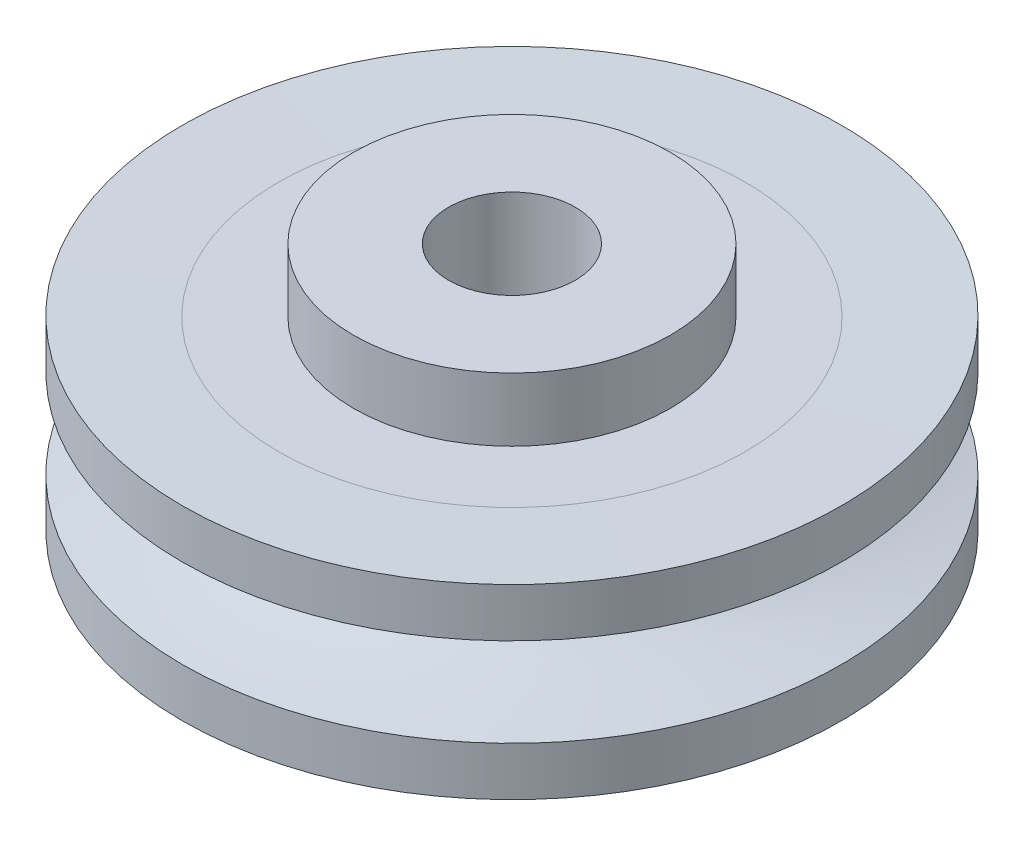
ISO-10303-21;
HEADER;
FILE_DESCRIPTION(('STEP AP214'),'2;1');
FILE_NAME('part.step','',(''),(''),'','','');
FILE_SCHEMA(('AUTOMOTIVE_DESIGN { 1 0 10303 214 1 1 1 1 }'));
ENDSEC;
DATA;
#1=APPLICATION_CONTEXT('core data for automotive mechanical design processes');
#2=APPLICATION_PROTOCOL_DEFINITION('international standard','automotive_design',2000,#1);
#3=PRODUCT_CONTEXT('',#1,'mechanical');
#4=PRODUCT('Part','Part','',(#3));
#5=PRODUCT_RELATED_PRODUCT_CATEGORY('part','',(#4));
#6=PRODUCT_DEFINITION_FORMATION('','',#4);
#7=PRODUCT_DEFINITION_CONTEXT('part definition',#1,'design');
#8=PRODUCT_DEFINITION('design','',#6,#7);
#9=PRODUCT_DEFINITION_SHAPE('','',#8);
#10=(LENGTH_UNIT() NAMED_UNIT(*) SI_UNIT(.MILLI.,.METRE.));
#11=(NAMED_UNIT(*) PLANE_ANGLE_UNIT() SI_UNIT($,.RADIAN.));
#12=(NAMED_UNIT(*) SI_UNIT($,.STERADIAN.) SOLID_ANGLE_UNIT());
#13=UNCERTAINTY_MEASURE_WITH_UNIT(LENGTH_MEASURE(1.E-05),#10,'distance_accuracy_value','');
#14=(GEOMETRIC_REPRESENTATION_CONTEXT(3) GLOBAL_UNCERTAINTY_ASSIGNED_CONTEXT((#13)) GLOBAL_UNIT_ASSIGNED_CONTEXT((#10,
#11,#12)) REPRESENTATION_CONTEXT('',''));
#15=CARTESIAN_POINT('',(0.,0.,0.));
#16=DIRECTION('',(0.,0.,1.));
#17=DIRECTION('',(1.,0.,0.));
#18=AXIS2_PLACEMENT_3D('',#15,#16,#17);
#19=CARTESIAN_POINT('',(0.999999999999999,-2.45,0.));
#20=DIRECTION('',(0.,1.,0.));
#21=DIRECTION('',(0.,0.,1.));
#22=AXIS2_PLACEMENT_3D('',#19,#20,#21);
#23=PLANE('',#22);
#24=CARTESIAN_POINT('',(0.,-2.45,0.));
#25=DIRECTION('',(0.,1.,0.));
#26=DIRECTION('',(0.,0.,1.));
#27=AXIS2_PLACEMENT_3D('',#24,#25,#26);
#28=CIRCLE('',#27,2.5);
#29=CARTESIAN_POINT('',(0.,-2.45,2.5));
#30=VERTEX_POINT('',#29);
#31=EDGE_CURVE('E78',#30,#30,#28,.T.);
#32=ORIENTED_EDGE('',*,*,#31,.F.);
#33=EDGE_LOOP('',(#32));
#34=FACE_BOUND('',#33,.T.);
#35=CARTESIAN_POINT('',(0.,-2.45,0.));
#36=DIRECTION('',(0.,1.,0.));
#37=DIRECTION('',(0.,0.,1.));
#38=AXIS2_PLACEMENT_3D('',#35,#36,#37);
#39=CIRCLE('',#38,0.999999999999999);
#40=CARTESIAN_POINT('',(0.,-2.45,0.999999999999999));
#41=VERTEX_POINT('',#40);
#42=EDGE_CURVE('E11',#41,#41,#39,.T.);
#43=ORIENTED_EDGE('',*,*,#42,.T.);
#44=EDGE_LOOP('',(#43));
#45=FACE_BOUND('',#44,.T.);
#46=ADVANCED_FACE('F38',(#34,#45),#23,.F.);
#47=CARTESIAN_POINT('',(0.,2.07863920952884,0.));
#48=DIRECTION('',(0.,1.,0.));
#49=DIRECTION('',(0.,0.,1.));
#50=AXIS2_PLACEMENT_3D('',#47,#48,#49);
#51=CYLINDRICAL_SURFACE('',#50,0.999999999999999);
#52=ORIENTED_EDGE('',*,*,#42,.F.);
#53=EDGE_LOOP('',(#52));
#54=FACE_BOUND('',#53,.T.);
#55=CARTESIAN_POINT('',(0.,2.45,0.));
#56=DIRECTION('',(0.,1.,0.));
#57=DIRECTION('',(0.,0.,1.));
#58=AXIS2_PLACEMENT_3D('',#55,#56,#57);
#59=CIRCLE('',#58,0.999999999999999);
#60=CARTESIAN_POINT('',(0.,2.45,0.999999999999999));
#61=VERTEX_POINT('',#60);
#62=EDGE_CURVE('E44',#61,#61,#59,.T.);
#63=ORIENTED_EDGE('',*,*,#62,.T.);
#64=EDGE_LOOP('',(#63));
#65=FACE_BOUND('',#64,.T.);
#66=ADVANCED_FACE('F113',(#54,#65),#51,.F.);
#67=CARTESIAN_POINT('',(0.999999999999999,2.45,0.));
#68=DIRECTION('',(0.,-1.,0.));
#69=DIRECTION('',(0.,0.,-1.));
#70=AXIS2_PLACEMENT_3D('',#67,#68,#69);
#71=PLANE('',#70);
#72=ORIENTED_EDGE('',*,*,#62,.F.);
#73=EDGE_LOOP('',(#72));
#74=FACE_BOUND('',#73,.T.);
#75=CARTESIAN_POINT('',(0.,2.45,0.));
#76=DIRECTION('',(0.,1.,0.));
#77=DIRECTION('',(0.,0.,1.));
#78=AXIS2_PLACEMENT_3D('',#75,#76,#77);
#79=CIRCLE('',#78,2.5);
#80=CARTESIAN_POINT('',(0.,2.45,2.5));
#81=VERTEX_POINT('',#80);
#82=EDGE_CURVE('E48',#81,#81,#79,.T.);
#83=ORIENTED_EDGE('',*,*,#82,.T.);
#84=EDGE_LOOP('',(#83));
#85=FACE_BOUND('',#84,.T.);
#86=ADVANCED_FACE('F110',(#74,#85),#71,.F.);
#87=CARTESIAN_POINT('',(0.,2.07863920952884,0.));
#88=DIRECTION('',(0.,1.,0.));
#89=DIRECTION('',(0.,0.,1.));
#90=AXIS2_PLACEMENT_3D('',#87,#88,#89);
#91=CYLINDRICAL_SURFACE('',#90,2.5);
#92=ORIENTED_EDGE('',*,*,#82,.F.);
#93=EDGE_LOOP('',(#92));
#94=FACE_BOUND('',#93,.T.);
#95=CARTESIAN_POINT('',(0.,1.45,0.));
#96=DIRECTION('',(0.,1.,0.));
#97=DIRECTION('',(0.,0.,1.));
#98=AXIS2_PLACEMENT_3D('',#95,#96,#97);
#99=CIRCLE('',#98,2.5);
#100=CARTESIAN_POINT('',(0.,1.45,2.5));
#101=VERTEX_POINT('',#100);
#102=EDGE_CURVE('E52',#101,#101,#99,.T.);
#103=ORIENTED_EDGE('',*,*,#102,.T.);
#104=EDGE_LOOP('',(#103));
#105=FACE_BOUND('',#104,.T.);
#106=ADVANCED_FACE('F106',(#94,#105),#91,.T.);
#107=CARTESIAN_POINT('',(2.5,1.45,0.));
#108=DIRECTION('',(0.,-1.,0.));
#109=DIRECTION('',(0.,0.,-1.));
#110=AXIS2_PLACEMENT_3D('',#107,#108,#109);
#111=PLANE('',#110);
#112=ORIENTED_EDGE('',*,*,#102,.F.);
#113=EDGE_LOOP('',(#112));
#114=FACE_BOUND('',#113,.T.);
#115=CARTESIAN_POINT('',(0.,1.45,0.));
#116=DIRECTION('',(0.,1.,0.));
#117=DIRECTION('',(0.,0.,1.));
#118=AXIS2_PLACEMENT_3D('',#115,#116,#117);
#119=CIRCLE('',#118,3.68309671521638);
#120=CARTESIAN_POINT('',(0.,1.45,3.68309671521638));
#121=VERTEX_POINT('',#120);
#122=EDGE_CURVE('E57',#121,#121,#119,.T.);
#123=ORIENTED_EDGE('',*,*,#122,.T.);
#124=EDGE_LOOP('',(#123));
#125=FACE_BOUND('',#124,.T.);
#126=ADVANCED_FACE('F102',(#114,#125),#111,.F.);
#127=CARTESIAN_POINT('',(0.,1.46954043278815,0.));
#128=DIRECTION('',(0.,1.,0.));
#129=DIRECTION('',(0.,0.,1.));
#130=AXIS2_PLACEMENT_3D('',#127,#128,#129);
#131=CONICAL_SURFACE('',#130,5.2,1.55791524713637);
#132=ORIENTED_EDGE('',*,*,#122,.F.);
#133=EDGE_LOOP('',(#132));
#134=FACE_BOUND('',#133,.T.);
#135=CARTESIAN_POINT('',(0.,1.46954043278815,0.));
#136=DIRECTION('',(0.,1.,0.));
#137=DIRECTION('',(0.,0.,1.));
#138=AXIS2_PLACEMENT_3D('',#135,#136,#137);
#139=CIRCLE('',#138,5.2);
#140=CARTESIAN_POINT('',(0.,1.46954043278815,5.2));
#141=VERTEX_POINT('',#140);
#142=EDGE_CURVE('E60',#141,#141,#139,.T.);
#143=ORIENTED_EDGE('',*,*,#142,.T.);
#144=EDGE_LOOP('',(#143));
#145=FACE_BOUND('',#144,.T.);
#146=ADVANCED_FACE('F98',(#134,#145),#131,.F.);
#147=CARTESIAN_POINT('',(0.,2.07863920952884,0.));
#148=DIRECTION('',(0.,1.,0.));
#149=DIRECTION('',(0.,0.,1.));
#150=AXIS2_PLACEMENT_3D('',#147,#148,#149);
#151=CYLINDRICAL_SURFACE('',#150,5.2);
#152=ORIENTED_EDGE('',*,*,#142,.F.);
#153=EDGE_LOOP('',(#152));
#154=FACE_BOUND('',#153,.T.);
#155=CARTESIAN_POINT('',(0.,0.700000000000001,0.));
#156=DIRECTION('',(0.,1.,0.));
#157=DIRECTION('',(0.,0.,1.));
#158=AXIS2_PLACEMENT_3D('',#155,#156,#157);
#159=CIRCLE('',#158,5.2);
#160=CARTESIAN_POINT('',(0.,0.700000000000001,5.2));
#161=VERTEX_POINT('',#160);
#162=EDGE_CURVE('E63',#161,#161,#159,.T.);
#163=ORIENTED_EDGE('',*,*,#162,.T.);
#164=EDGE_LOOP('',(#163));
#165=FACE_BOUND('',#164,.T.);
#166=ADVANCED_FACE('F93',(#154,#165),#151,.T.);
#167=CARTESIAN_POINT('',(5.2,-0.699999999999999,0.));
#168=CARTESIAN_POINT('',(2.07518291562221,0.,0.));
#169=CARTESIAN_POINT('',(5.2,0.700000000000001,0.));
#170=(BOUNDED_CURVE() B_SPLINE_CURVE(2,(#167,#168,#169),.UNSPECIFIED.,.F.,
.F.) B_SPLINE_CURVE_WITH_KNOTS((3,3),(0.,1.),
.UNSPECIFIED.) CURVE() GEOMETRIC_REPRESENTATION_ITEM() RATIONAL_B_SPLINE_CURVE((1.,
1.04930618655344,1.)) REPRESENTATION_ITEM(''));
#171=CARTESIAN_POINT('',(0.,2.07863920952884,0.));
#172=DIRECTION('',(0.,1.,0.));
#173=AXIS1_PLACEMENT('',#171,#172);
#174=SURFACE_OF_REVOLUTION('',#170,#173);
#175=ORIENTED_EDGE('',*,*,#162,.F.);
#176=EDGE_LOOP('',(#175));
#177=FACE_BOUND('',#176,.T.);
#178=CARTESIAN_POINT('',(0.,-0.7,0.));
#179=DIRECTION('',(0.,1.,0.));
#180=DIRECTION('',(0.,0.,1.));
#181=AXIS2_PLACEMENT_3D('',#178,#179,#180);
#182=CIRCLE('',#181,5.2);
#183=CARTESIAN_POINT('',(0.,-0.7,5.2));
#184=VERTEX_POINT('',#183);
#185=EDGE_CURVE('E66',#184,#184,#182,.T.);
#186=ORIENTED_EDGE('',*,*,#185,.T.);
#187=EDGE_LOOP('',(#186));
#188=FACE_BOUND('',#187,.T.);
#189=ADVANCED_FACE('F88',(#177,#188),#174,.T.);
#190=CARTESIAN_POINT('',(0.,2.07863920952884,0.));
#191=DIRECTION('',(0.,1.,0.));
#192=DIRECTION('',(0.,0.,1.));
#193=AXIS2_PLACEMENT_3D('',#190,#191,#192);
#194=CYLINDRICAL_SURFACE('',#193,5.2);
#195=ORIENTED_EDGE('',*,*,#185,.F.);
#196=EDGE_LOOP('',(#195));
#197=FACE_BOUND('',#196,.T.);
#198=CARTESIAN_POINT('',(0.,-1.46954043278815,0.));
#199=DIRECTION('',(0.,1.,0.));
#200=DIRECTION('',(0.,0.,1.));
#201=AXIS2_PLACEMENT_3D('',#198,#199,#200);
#202=CIRCLE('',#201,5.2);
#203=CARTESIAN_POINT('',(0.,-1.46954043278815,5.2));
#204=VERTEX_POINT('',#203);
#205=EDGE_CURVE('E69',#204,#204,#202,.T.);
#206=ORIENTED_EDGE('',*,*,#205,.T.);
#207=EDGE_LOOP('',(#206));
#208=FACE_BOUND('',#207,.T.);
#209=ADVANCED_FACE('F92',(#197,#208),#194,.T.);
#210=CARTESIAN_POINT('',(0.,-1.45,0.));
#211=DIRECTION('',(0.,-1.,0.));
#212=DIRECTION('',(0.,0.,-1.));
#213=AXIS2_PLACEMENT_3D('',#210,#211,#212);
#214=CONICAL_SURFACE('',#213,3.68309671521638,1.55791524713637);
#215=ORIENTED_EDGE('',*,*,#205,.F.);
#216=EDGE_LOOP('',(#215));
#217=FACE_BOUND('',#216,.T.);
#218=CARTESIAN_POINT('',(0.,-1.45,0.));
#219=DIRECTION('',(0.,1.,0.));
#220=DIRECTION('',(0.,0.,1.));
#221=AXIS2_PLACEMENT_3D('',#218,#219,#220);
#222=CIRCLE('',#221,3.68309671521638);
#223=CARTESIAN_POINT('',(0.,-1.45,3.68309671521638));
#224=VERTEX_POINT('',#223);
#225=EDGE_CURVE('E72',#224,#224,#222,.T.);
#226=ORIENTED_EDGE('',*,*,#225,.T.);
#227=EDGE_LOOP('',(#226));
#228=FACE_BOUND('',#227,.T.);
#229=ADVANCED_FACE('F133',(#217,#228),#214,.F.);
#230=CARTESIAN_POINT('',(2.5,-1.45,0.));
#231=DIRECTION('',(0.,1.,0.));
#232=DIRECTION('',(0.,0.,1.));
#233=AXIS2_PLACEMENT_3D('',#230,#231,#232);
#234=PLANE('',#233);
#235=ORIENTED_EDGE('',*,*,#225,.F.);
#236=EDGE_LOOP('',(#235));
#237=FACE_BOUND('',#236,.T.);
#238=CARTESIAN_POINT('',(0.,-1.45,0.));
#239=DIRECTION('',(0.,1.,0.));
#240=DIRECTION('',(0.,0.,1.));
#241=AXIS2_PLACEMENT_3D('',#238,#239,#240);
#242=CIRCLE('',#241,2.5);
#243=CARTESIAN_POINT('',(0.,-1.45,2.5));
#244=VERTEX_POINT('',#243);
#245=EDGE_CURVE('E75',#244,#244,#242,.T.);
#246=ORIENTED_EDGE('',*,*,#245,.T.);
#247=EDGE_LOOP('',(#246));
#248=FACE_BOUND('',#247,.T.);
#249=ADVANCED_FACE('F127',(#237,#248),#234,.F.);
#250=CARTESIAN_POINT('',(0.,2.07863920952884,0.));
#251=DIRECTION('',(0.,1.,0.));
#252=DIRECTION('',(0.,0.,1.));
#253=AXIS2_PLACEMENT_3D('',#250,#251,#252);
#254=CYLINDRICAL_SURFACE('',#253,2.5);
#255=ORIENTED_EDGE('',*,*,#245,.F.);
#256=EDGE_LOOP('',(#255));
#257=FACE_BOUND('',#256,.T.);
#258=ORIENTED_EDGE('',*,*,#31,.T.);
#259=EDGE_LOOP('',(#258));
#260=FACE_BOUND('',#259,.T.);
#261=ADVANCED_FACE('F125',(#257,#260),#254,.T.);
#262=CLOSED_SHELL('',(#46,#66,#86,#106,#126,#146,#166,#189,#209,#229,#249,#261));
#263=MANIFOLD_SOLID_BREP('B2',#262);
#264=ADVANCED_BREP_SHAPE_REPRESENTATION('',(#18,#263),#14);
#265=SHAPE_DEFINITION_REPRESENTATION(#9,#264);
ENDSEC;
END-ISO-10303-21;
